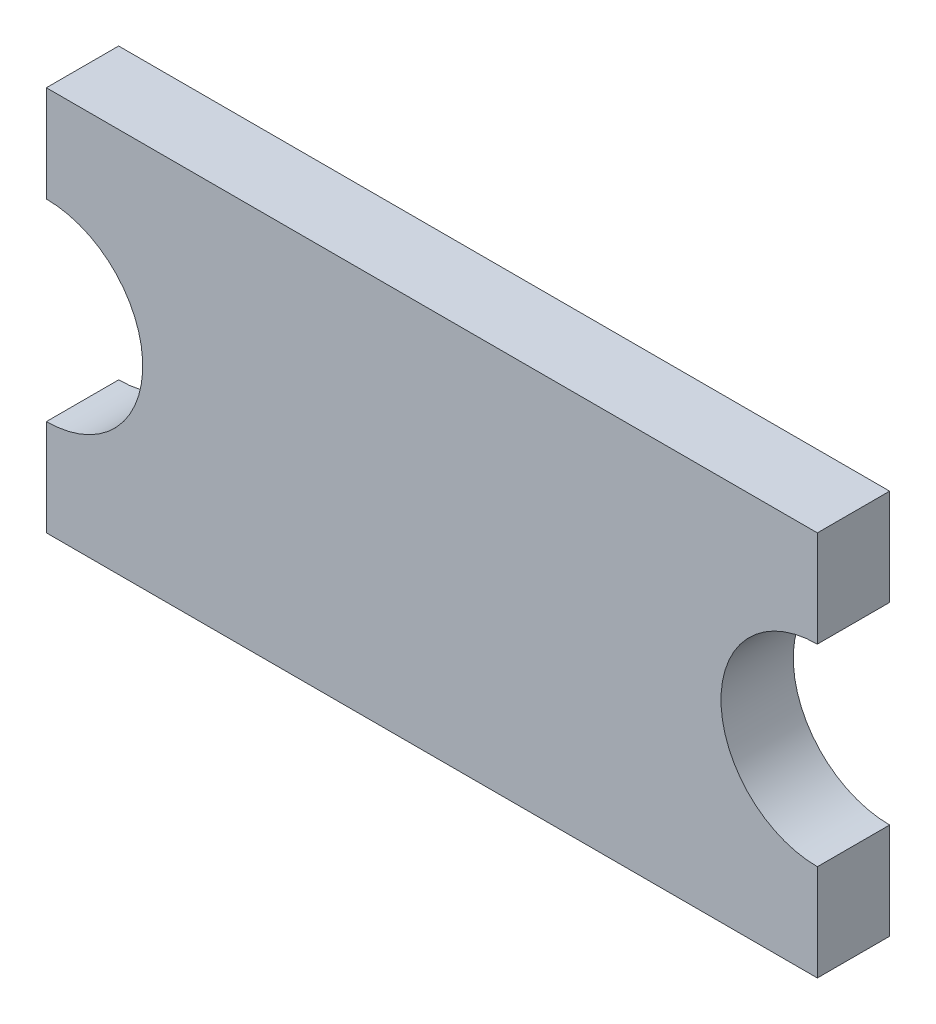
ISO-10303-21;
HEADER;
FILE_DESCRIPTION(('STEP AP214'),'2;1');
FILE_NAME('part.step','',(''),(''),'','','');
FILE_SCHEMA(('AUTOMOTIVE_DESIGN { 1 0 10303 214 1 1 1 1 }'));
ENDSEC;
DATA;
#1=APPLICATION_CONTEXT('core data for automotive mechanical design processes');
#2=APPLICATION_PROTOCOL_DEFINITION('international standard','automotive_design',2000,#1);
#3=PRODUCT_CONTEXT('',#1,'mechanical');
#4=PRODUCT('Part','Part','',(#3));
#5=PRODUCT_RELATED_PRODUCT_CATEGORY('part','',(#4));
#6=PRODUCT_DEFINITION_FORMATION('','',#4);
#7=PRODUCT_DEFINITION_CONTEXT('part definition',#1,'design');
#8=PRODUCT_DEFINITION('design','',#6,#7);
#9=PRODUCT_DEFINITION_SHAPE('','',#8);
#10=(LENGTH_UNIT() NAMED_UNIT(*) SI_UNIT(.MILLI.,.METRE.));
#11=(NAMED_UNIT(*) PLANE_ANGLE_UNIT() SI_UNIT($,.RADIAN.));
#12=(NAMED_UNIT(*) SI_UNIT($,.STERADIAN.) SOLID_ANGLE_UNIT());
#13=UNCERTAINTY_MEASURE_WITH_UNIT(LENGTH_MEASURE(1.E-05),#10,'distance_accuracy_value','');
#14=(GEOMETRIC_REPRESENTATION_CONTEXT(3) GLOBAL_UNCERTAINTY_ASSIGNED_CONTEXT((#13)) GLOBAL_UNIT_ASSIGNED_CONTEXT((#10,
#11,#12)) REPRESENTATION_CONTEXT('',''));
#15=CARTESIAN_POINT('',(0.,0.,0.));
#16=DIRECTION('',(0.,0.,1.));
#17=DIRECTION('',(1.,0.,0.));
#18=AXIS2_PLACEMENT_3D('',#15,#16,#17);
#19=CARTESIAN_POINT('',(0.,0.,0.15));
#20=DIRECTION('',(0.,0.,1.));
#21=DIRECTION('',(1.,0.,0.));
#22=AXIS2_PLACEMENT_3D('',#19,#20,#21);
#23=PLANE('',#22);
#24=CARTESIAN_POINT('',(0.8,0.,0.15));
#25=DIRECTION('',(0.,0.,1.));
#26=DIRECTION('',(1.,0.,0.));
#27=AXIS2_PLACEMENT_3D('',#24,#25,#26);
#28=CIRCLE('',#27,0.2);
#29=CARTESIAN_POINT('',(0.8,-0.2,0.15));
#30=VERTEX_POINT('',#29);
#31=CARTESIAN_POINT('',(0.8,0.2,0.15));
#32=VERTEX_POINT('',#31);
#33=EDGE_CURVE('E20',#30,#32,#28,.F.);
#34=ORIENTED_EDGE('',*,*,#33,.T.);
#35=DIRECTION('',(0.,1.,0.));
#36=VECTOR('',#35,1.);
#37=CARTESIAN_POINT('',(0.8,0.,0.15));
#38=LINE('',#37,#36);
#39=CARTESIAN_POINT('',(0.8,0.4,0.15));
#40=VERTEX_POINT('',#39);
#41=EDGE_CURVE('E150',#32,#40,#38,.T.);
#42=ORIENTED_EDGE('',*,*,#41,.T.);
#43=DIRECTION('',(1.,0.,0.));
#44=VECTOR('',#43,1.);
#45=CARTESIAN_POINT('',(-0.8,0.4,0.15));
#46=LINE('',#45,#44);
#47=CARTESIAN_POINT('',(-0.8,0.4,0.15));
#48=VERTEX_POINT('',#47);
#49=EDGE_CURVE('E148',#48,#40,#46,.T.);
#50=ORIENTED_EDGE('',*,*,#49,.F.);
#51=DIRECTION('',(0.,1.,0.));
#52=VECTOR('',#51,1.);
#53=CARTESIAN_POINT('',(-0.8,-0.4,0.15));
#54=LINE('',#53,#52);
#55=CARTESIAN_POINT('',(-0.8,0.2,0.15));
#56=VERTEX_POINT('',#55);
#57=EDGE_CURVE('E72',#56,#48,#54,.T.);
#58=ORIENTED_EDGE('',*,*,#57,.F.);
#59=CARTESIAN_POINT('',(-0.8,0.,0.15));
#60=DIRECTION('',(0.,0.,1.));
#61=DIRECTION('',(1.,0.,0.));
#62=AXIS2_PLACEMENT_3D('',#59,#60,#61);
#63=CIRCLE('',#62,0.2);
#64=CARTESIAN_POINT('',(-0.8,-0.2,0.15));
#65=VERTEX_POINT('',#64);
#66=EDGE_CURVE('E144',#56,#65,#63,.F.);
#67=ORIENTED_EDGE('',*,*,#66,.T.);
#68=DIRECTION('',(0.,1.,0.));
#69=VECTOR('',#68,1.);
#70=CARTESIAN_POINT('',(-0.8,-0.4,0.15));
#71=LINE('',#70,#69);
#72=CARTESIAN_POINT('',(-0.8,-0.4,0.15));
#73=VERTEX_POINT('',#72);
#74=EDGE_CURVE('E143',#73,#65,#71,.T.);
#75=ORIENTED_EDGE('',*,*,#74,.F.);
#76=DIRECTION('',(1.,0.,0.));
#77=VECTOR('',#76,1.);
#78=CARTESIAN_POINT('',(0.8,-0.4,0.15));
#79=LINE('',#78,#77);
#80=CARTESIAN_POINT('',(0.8,-0.4,0.15));
#81=VERTEX_POINT('',#80);
#82=EDGE_CURVE('E86',#81,#73,#79,.F.);
#83=ORIENTED_EDGE('',*,*,#82,.F.);
#84=DIRECTION('',(0.,1.,0.));
#85=VECTOR('',#84,1.);
#86=CARTESIAN_POINT('',(0.8,0.,0.15));
#87=LINE('',#86,#85);
#88=EDGE_CURVE('E62',#81,#30,#87,.T.);
#89=ORIENTED_EDGE('',*,*,#88,.T.);
#90=EDGE_LOOP('',(#34,#42,#50,#58,#67,#75,#83,#89));
#91=FACE_BOUND('',#90,.T.);
#92=ADVANCED_FACE('F17',(#91),#23,.T.);
#93=CARTESIAN_POINT('',(-0.8,0.4,0.));
#94=DIRECTION('',(0.,1.,0.));
#95=DIRECTION('',(0.,0.,1.));
#96=AXIS2_PLACEMENT_3D('',#93,#94,#95);
#97=PLANE('',#96);
#98=DIRECTION('',(0.,0.,-1.));
#99=VECTOR('',#98,1.);
#100=CARTESIAN_POINT('',(0.8,0.4,0.));
#101=LINE('',#100,#99);
#102=CARTESIAN_POINT('',(0.8,0.4,0.));
#103=VERTEX_POINT('',#102);
#104=EDGE_CURVE('E114',#103,#40,#101,.F.);
#105=ORIENTED_EDGE('',*,*,#104,.F.);
#106=DIRECTION('',(1.,0.,0.));
#107=VECTOR('',#106,1.);
#108=CARTESIAN_POINT('',(0.,0.4,0.));
#109=LINE('',#108,#107);
#110=CARTESIAN_POINT('',(-0.8,0.4,0.));
#111=VERTEX_POINT('',#110);
#112=EDGE_CURVE('E95',#103,#111,#109,.F.);
#113=ORIENTED_EDGE('',*,*,#112,.T.);
#114=DIRECTION('',(0.,0.,1.));
#115=VECTOR('',#114,1.);
#116=CARTESIAN_POINT('',(-0.8,0.4,0.));
#117=LINE('',#116,#115);
#118=EDGE_CURVE('E99',#48,#111,#117,.F.);
#119=ORIENTED_EDGE('',*,*,#118,.F.);
#120=ORIENTED_EDGE('',*,*,#49,.T.);
#121=EDGE_LOOP('',(#105,#113,#119,#120));
#122=FACE_BOUND('',#121,.T.);
#123=ADVANCED_FACE('F112',(#122),#97,.T.);
#124=CARTESIAN_POINT('',(-0.8,-0.4,0.));
#125=DIRECTION('',(-1.,0.,0.));
#126=DIRECTION('',(0.,0.,1.));
#127=AXIS2_PLACEMENT_3D('',#124,#125,#126);
#128=PLANE('',#127);
#129=ORIENTED_EDGE('',*,*,#57,.T.);
#130=ORIENTED_EDGE('',*,*,#118,.T.);
#131=DIRECTION('',(0.,1.,0.));
#132=VECTOR('',#131,1.);
#133=CARTESIAN_POINT('',(-0.8,0.,0.));
#134=LINE('',#133,#132);
#135=CARTESIAN_POINT('',(-0.8,0.2,0.));
#136=VERTEX_POINT('',#135);
#137=EDGE_CURVE('E101',#111,#136,#134,.F.);
#138=ORIENTED_EDGE('',*,*,#137,.T.);
#139=DIRECTION('',(0.,0.,1.));
#140=VECTOR('',#139,1.);
#141=CARTESIAN_POINT('',(-0.8,0.2,0.15));
#142=LINE('',#141,#140);
#143=EDGE_CURVE('E104',#136,#56,#142,.T.);
#144=ORIENTED_EDGE('',*,*,#143,.T.);
#145=EDGE_LOOP('',(#129,#130,#138,#144));
#146=FACE_BOUND('',#145,.T.);
#147=ADVANCED_FACE('F100',(#146),#128,.T.);
#148=CARTESIAN_POINT('',(-0.8,0.,0.15));
#149=DIRECTION('',(0.,0.,1.));
#150=DIRECTION('',(1.,0.,0.));
#151=AXIS2_PLACEMENT_3D('',#148,#149,#150);
#152=CYLINDRICAL_SURFACE('',#151,0.2);
#153=DIRECTION('',(0.,0.,1.));
#154=VECTOR('',#153,1.);
#155=CARTESIAN_POINT('',(-0.8,-0.2,0.));
#156=LINE('',#155,#154);
#157=CARTESIAN_POINT('',(-0.8,-0.2,0.));
#158=VERTEX_POINT('',#157);
#159=EDGE_CURVE('E140',#65,#158,#156,.F.);
#160=ORIENTED_EDGE('',*,*,#159,.F.);
#161=ORIENTED_EDGE('',*,*,#66,.F.);
#162=ORIENTED_EDGE('',*,*,#143,.F.);
#163=CARTESIAN_POINT('',(-0.8,0.,0.));
#164=DIRECTION('',(0.,0.,1.));
#165=DIRECTION('',(1.,0.,0.));
#166=AXIS2_PLACEMENT_3D('',#163,#164,#165);
#167=CIRCLE('',#166,0.2);
#168=EDGE_CURVE('E110',#136,#158,#167,.F.);
#169=ORIENTED_EDGE('',*,*,#168,.T.);
#170=EDGE_LOOP('',(#160,#161,#162,#169));
#171=FACE_BOUND('',#170,.T.);
#172=ADVANCED_FACE('F174',(#171),#152,.F.);
#173=CARTESIAN_POINT('',(-0.8,-0.4,0.));
#174=DIRECTION('',(-1.,0.,0.));
#175=DIRECTION('',(0.,0.,1.));
#176=AXIS2_PLACEMENT_3D('',#173,#174,#175);
#177=PLANE('',#176);
#178=ORIENTED_EDGE('',*,*,#74,.T.);
#179=ORIENTED_EDGE('',*,*,#159,.T.);
#180=DIRECTION('',(0.,1.,0.));
#181=VECTOR('',#180,1.);
#182=CARTESIAN_POINT('',(-0.8,0.,0.));
#183=LINE('',#182,#181);
#184=CARTESIAN_POINT('',(-0.8,-0.4,0.));
#185=VERTEX_POINT('',#184);
#186=EDGE_CURVE('E134',#158,#185,#183,.F.);
#187=ORIENTED_EDGE('',*,*,#186,.T.);
#188=DIRECTION('',(0.,0.,-1.));
#189=VECTOR('',#188,1.);
#190=CARTESIAN_POINT('',(-0.8,-0.4,0.));
#191=LINE('',#190,#189);
#192=EDGE_CURVE('E127',#73,#185,#191,.T.);
#193=ORIENTED_EDGE('',*,*,#192,.F.);
#194=EDGE_LOOP('',(#178,#179,#187,#193));
#195=FACE_BOUND('',#194,.T.);
#196=ADVANCED_FACE('F177',(#195),#177,.T.);
#197=CARTESIAN_POINT('',(0.8,-0.4,0.));
#198=DIRECTION('',(0.,-1.,0.));
#199=DIRECTION('',(0.,0.,-1.));
#200=AXIS2_PLACEMENT_3D('',#197,#198,#199);
#201=PLANE('',#200);
#202=ORIENTED_EDGE('',*,*,#192,.T.);
#203=DIRECTION('',(1.,0.,0.));
#204=VECTOR('',#203,1.);
#205=CARTESIAN_POINT('',(0.,-0.4,0.));
#206=LINE('',#205,#204);
#207=CARTESIAN_POINT('',(0.8,-0.4,0.));
#208=VERTEX_POINT('',#207);
#209=EDGE_CURVE('E130',#185,#208,#206,.T.);
#210=ORIENTED_EDGE('',*,*,#209,.T.);
#211=DIRECTION('',(0.,0.,-1.));
#212=VECTOR('',#211,1.);
#213=CARTESIAN_POINT('',(0.8,-0.4,0.));
#214=LINE('',#213,#212);
#215=EDGE_CURVE('E125',#81,#208,#214,.T.);
#216=ORIENTED_EDGE('',*,*,#215,.F.);
#217=ORIENTED_EDGE('',*,*,#82,.T.);
#218=EDGE_LOOP('',(#202,#210,#216,#217));
#219=FACE_BOUND('',#218,.T.);
#220=ADVANCED_FACE('F195',(#219),#201,.T.);
#221=CARTESIAN_POINT('',(0.8,0.4,0.));
#222=DIRECTION('',(1.,0.,0.));
#223=DIRECTION('',(0.,0.,-1.));
#224=AXIS2_PLACEMENT_3D('',#221,#222,#223);
#225=PLANE('',#224);
#226=ORIENTED_EDGE('',*,*,#88,.F.);
#227=ORIENTED_EDGE('',*,*,#215,.T.);
#228=DIRECTION('',(0.,1.,0.));
#229=VECTOR('',#228,1.);
#230=CARTESIAN_POINT('',(0.8,0.,0.));
#231=LINE('',#230,#229);
#232=CARTESIAN_POINT('',(0.8,-0.2,0.));
#233=VERTEX_POINT('',#232);
#234=EDGE_CURVE('E133',#208,#233,#231,.T.);
#235=ORIENTED_EDGE('',*,*,#234,.T.);
#236=DIRECTION('',(0.,0.,1.));
#237=VECTOR('',#236,1.);
#238=CARTESIAN_POINT('',(0.8,-0.2,0.15));
#239=LINE('',#238,#237);
#240=EDGE_CURVE('E123',#233,#30,#239,.T.);
#241=ORIENTED_EDGE('',*,*,#240,.T.);
#242=EDGE_LOOP('',(#226,#227,#235,#241));
#243=FACE_BOUND('',#242,.T.);
#244=ADVANCED_FACE('F192',(#243),#225,.T.);
#245=CARTESIAN_POINT('',(0.8,0.,0.15));
#246=DIRECTION('',(0.,0.,1.));
#247=DIRECTION('',(1.,0.,0.));
#248=AXIS2_PLACEMENT_3D('',#245,#246,#247);
#249=CYLINDRICAL_SURFACE('',#248,0.2);
#250=CARTESIAN_POINT('',(0.8,0.,0.));
#251=DIRECTION('',(0.,0.,1.));
#252=DIRECTION('',(1.,0.,0.));
#253=AXIS2_PLACEMENT_3D('',#250,#251,#252);
#254=CIRCLE('',#253,0.2);
#255=CARTESIAN_POINT('',(0.8,0.2,0.));
#256=VERTEX_POINT('',#255);
#257=EDGE_CURVE('E26',#233,#256,#254,.F.);
#258=ORIENTED_EDGE('',*,*,#257,.T.);
#259=DIRECTION('',(0.,0.,-1.));
#260=VECTOR('',#259,1.);
#261=CARTESIAN_POINT('',(0.8,0.2,0.));
#262=LINE('',#261,#260);
#263=EDGE_CURVE('E34',#32,#256,#262,.T.);
#264=ORIENTED_EDGE('',*,*,#263,.F.);
#265=ORIENTED_EDGE('',*,*,#33,.F.);
#266=ORIENTED_EDGE('',*,*,#240,.F.);
#267=EDGE_LOOP('',(#258,#264,#265,#266));
#268=FACE_BOUND('',#267,.T.);
#269=ADVANCED_FACE('F191',(#268),#249,.F.);
#270=CARTESIAN_POINT('',(0.8,0.4,0.));
#271=DIRECTION('',(1.,0.,0.));
#272=DIRECTION('',(0.,0.,-1.));
#273=AXIS2_PLACEMENT_3D('',#270,#271,#272);
#274=PLANE('',#273);
#275=ORIENTED_EDGE('',*,*,#41,.F.);
#276=ORIENTED_EDGE('',*,*,#263,.T.);
#277=DIRECTION('',(0.,1.,0.));
#278=VECTOR('',#277,1.);
#279=CARTESIAN_POINT('',(0.8,0.,0.));
#280=LINE('',#279,#278);
#281=EDGE_CURVE('E11',#256,#103,#280,.T.);
#282=ORIENTED_EDGE('',*,*,#281,.T.);
#283=ORIENTED_EDGE('',*,*,#104,.T.);
#284=EDGE_LOOP('',(#275,#276,#282,#283));
#285=FACE_BOUND('',#284,.T.);
#286=ADVANCED_FACE('F188',(#285),#274,.T.);
#287=CARTESIAN_POINT('',(0.,0.,0.));
#288=DIRECTION('',(0.,0.,1.));
#289=DIRECTION('',(1.,0.,0.));
#290=AXIS2_PLACEMENT_3D('',#287,#288,#289);
#291=PLANE('',#290);
#292=ORIENTED_EDGE('',*,*,#257,.F.);
#293=ORIENTED_EDGE('',*,*,#234,.F.);
#294=ORIENTED_EDGE('',*,*,#209,.F.);
#295=ORIENTED_EDGE('',*,*,#186,.F.);
#296=ORIENTED_EDGE('',*,*,#168,.F.);
#297=ORIENTED_EDGE('',*,*,#137,.F.);
#298=ORIENTED_EDGE('',*,*,#112,.F.);
#299=ORIENTED_EDGE('',*,*,#281,.F.);
#300=EDGE_LOOP('',(#292,#293,#294,#295,#296,#297,#298,#299));
#301=FACE_BOUND('',#300,.T.);
#302=ADVANCED_FACE('F108',(#301),#291,.F.);
#303=CLOSED_SHELL('',(#92,#123,#147,#172,#196,#220,#244,#269,#286,#302));
#304=MANIFOLD_SOLID_BREP('B1',#303);
#305=ADVANCED_BREP_SHAPE_REPRESENTATION('',(#18,#304),#14);
#306=SHAPE_DEFINITION_REPRESENTATION(#9,#305);
ENDSEC;
END-ISO-10303-21;
